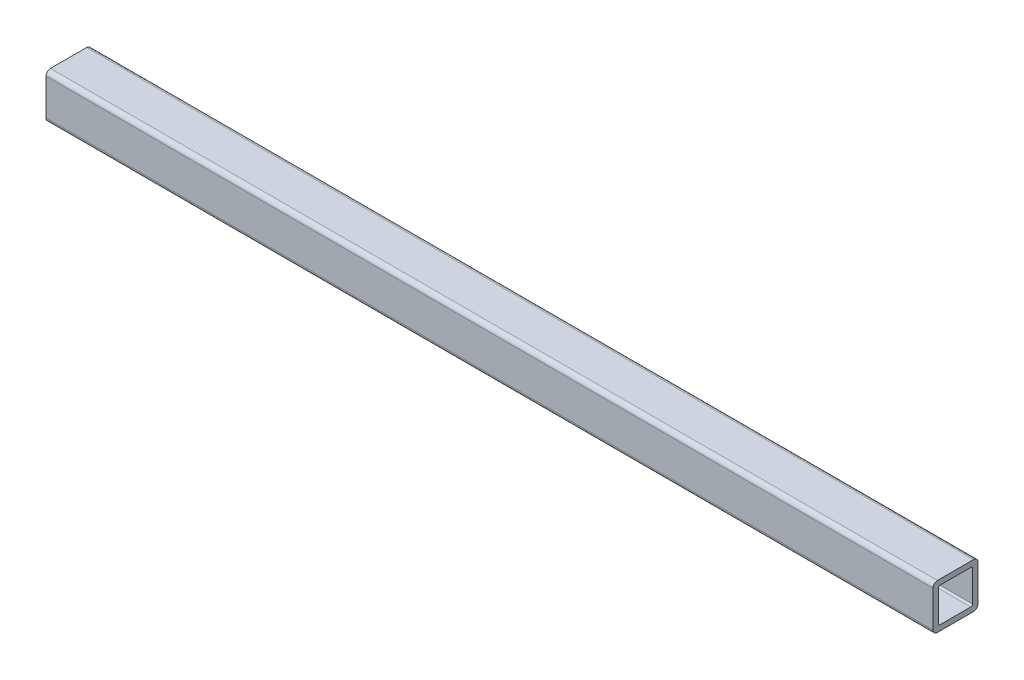
ISO-10303-21;
HEADER;
FILE_DESCRIPTION(('STEP AP214'),'2;1');
FILE_NAME('part.step','',(''),(''),'','','');
FILE_SCHEMA(('AUTOMOTIVE_DESIGN { 1 0 10303 214 1 1 1 1 }'));
ENDSEC;
DATA;
#1=APPLICATION_CONTEXT('core data for automotive mechanical design processes');
#2=APPLICATION_PROTOCOL_DEFINITION('international standard','automotive_design',2000,#1);
#3=PRODUCT_CONTEXT('',#1,'mechanical');
#4=PRODUCT('Part','Part','',(#3));
#5=PRODUCT_RELATED_PRODUCT_CATEGORY('part','',(#4));
#6=PRODUCT_DEFINITION_FORMATION('','',#4);
#7=PRODUCT_DEFINITION_CONTEXT('part definition',#1,'design');
#8=PRODUCT_DEFINITION('design','',#6,#7);
#9=PRODUCT_DEFINITION_SHAPE('','',#8);
#10=(LENGTH_UNIT() NAMED_UNIT(*) SI_UNIT(.MILLI.,.METRE.));
#11=(NAMED_UNIT(*) PLANE_ANGLE_UNIT() SI_UNIT($,.RADIAN.));
#12=(NAMED_UNIT(*) SI_UNIT($,.STERADIAN.) SOLID_ANGLE_UNIT());
#13=UNCERTAINTY_MEASURE_WITH_UNIT(LENGTH_MEASURE(1.E-05),#10,'distance_accuracy_value','');
#14=(GEOMETRIC_REPRESENTATION_CONTEXT(3) GLOBAL_UNCERTAINTY_ASSIGNED_CONTEXT((#13)) GLOBAL_UNIT_ASSIGNED_CONTEXT((#10,
#11,#12)) REPRESENTATION_CONTEXT('',''));
#15=CARTESIAN_POINT('',(0.,0.,0.));
#16=DIRECTION('',(0.,0.,1.));
#17=DIRECTION('',(1.,0.,0.));
#18=AXIS2_PLACEMENT_3D('',#15,#16,#17);
#19=CARTESIAN_POINT('',(-500.,12.7,-12.7));
#20=DIRECTION('',(0.,0.,-1.));
#21=DIRECTION('',(0.,1.,0.));
#22=AXIS2_PLACEMENT_3D('',#19,#20,#21);
#23=PLANE('',#22);
#24=DIRECTION('',(0.,1.,0.));
#25=VECTOR('',#24,1.);
#26=CARTESIAN_POINT('',(0.,12.7,-12.7));
#27=LINE('',#26,#25);
#28=CARTESIAN_POINT('',(0.,-10.2,-12.7));
#29=VERTEX_POINT('',#28);
#30=CARTESIAN_POINT('',(0.,10.2,-12.7));
#31=VERTEX_POINT('',#30);
#32=EDGE_CURVE('E258',#29,#31,#27,.T.);
#33=ORIENTED_EDGE('',*,*,#32,.F.);
#34=DIRECTION('',(1.,0.,0.));
#35=VECTOR('',#34,1.);
#36=CARTESIAN_POINT('',(-500.,-10.2,-12.7));
#37=LINE('',#36,#35);
#38=CARTESIAN_POINT('',(-500.,-10.2,-12.7));
#39=VERTEX_POINT('',#38);
#40=EDGE_CURVE('E187',#29,#39,#37,.F.);
#41=ORIENTED_EDGE('',*,*,#40,.T.);
#42=DIRECTION('',(0.,1.,0.));
#43=VECTOR('',#42,1.);
#44=CARTESIAN_POINT('',(-500.,12.7,-12.7));
#45=LINE('',#44,#43);
#46=CARTESIAN_POINT('',(-500.,10.2,-12.7));
#47=VERTEX_POINT('',#46);
#48=EDGE_CURVE('E168',#39,#47,#45,.T.);
#49=ORIENTED_EDGE('',*,*,#48,.T.);
#50=DIRECTION('',(1.,0.,0.));
#51=VECTOR('',#50,1.);
#52=CARTESIAN_POINT('',(-500.,10.2,-12.7));
#53=LINE('',#52,#51);
#54=EDGE_CURVE('E184',#47,#31,#53,.T.);
#55=ORIENTED_EDGE('',*,*,#54,.T.);
#56=EDGE_LOOP('',(#33,#41,#49,#55));
#57=FACE_BOUND('',#56,.T.);
#58=ADVANCED_FACE('F33',(#57),#23,.T.);
#59=CARTESIAN_POINT('',(-500.,-12.7,12.7));
#60=DIRECTION('',(0.,-1.,0.));
#61=DIRECTION('',(0.,0.,-1.));
#62=AXIS2_PLACEMENT_3D('',#59,#60,#61);
#63=PLANE('',#62);
#64=DIRECTION('',(0.,0.,-1.));
#65=VECTOR('',#64,1.);
#66=CARTESIAN_POINT('',(-500.,-12.7,12.7));
#67=LINE('',#66,#65);
#68=CARTESIAN_POINT('',(-500.,-12.7,10.2));
#69=VERTEX_POINT('',#68);
#70=CARTESIAN_POINT('',(-500.,-12.7,-10.2));
#71=VERTEX_POINT('',#70);
#72=EDGE_CURVE('E173',#69,#71,#67,.T.);
#73=ORIENTED_EDGE('',*,*,#72,.T.);
#74=DIRECTION('',(1.,0.,0.));
#75=VECTOR('',#74,1.);
#76=CARTESIAN_POINT('',(-500.,-12.7,-10.2));
#77=LINE('',#76,#75);
#78=CARTESIAN_POINT('',(0.,-12.7,-10.2));
#79=VERTEX_POINT('',#78);
#80=EDGE_CURVE('E167',#71,#79,#77,.T.);
#81=ORIENTED_EDGE('',*,*,#80,.T.);
#82=DIRECTION('',(0.,0.,-1.));
#83=VECTOR('',#82,1.);
#84=CARTESIAN_POINT('',(0.,-12.7,12.7));
#85=LINE('',#84,#83);
#86=CARTESIAN_POINT('',(0.,-12.7,10.2));
#87=VERTEX_POINT('',#86);
#88=EDGE_CURVE('E150',#87,#79,#85,.T.);
#89=ORIENTED_EDGE('',*,*,#88,.F.);
#90=DIRECTION('',(1.,0.,0.));
#91=VECTOR('',#90,1.);
#92=CARTESIAN_POINT('',(-500.,-12.7,10.2));
#93=LINE('',#92,#91);
#94=EDGE_CURVE('E164',#87,#69,#93,.F.);
#95=ORIENTED_EDGE('',*,*,#94,.T.);
#96=EDGE_LOOP('',(#73,#81,#89,#95));
#97=FACE_BOUND('',#96,.T.);
#98=ADVANCED_FACE('F163',(#97),#63,.T.);
#99=CARTESIAN_POINT('',(-500.,12.7,12.7));
#100=DIRECTION('',(0.,0.,1.));
#101=DIRECTION('',(0.,-1.,0.));
#102=AXIS2_PLACEMENT_3D('',#99,#100,#101);
#103=PLANE('',#102);
#104=DIRECTION('',(0.,-1.,0.));
#105=VECTOR('',#104,1.);
#106=CARTESIAN_POINT('',(-500.,12.7,12.7));
#107=LINE('',#106,#105);
#108=CARTESIAN_POINT('',(-500.,10.2,12.7));
#109=VERTEX_POINT('',#108);
#110=CARTESIAN_POINT('',(-500.,-10.2,12.7));
#111=VERTEX_POINT('',#110);
#112=EDGE_CURVE('E177',#109,#111,#107,.T.);
#113=ORIENTED_EDGE('',*,*,#112,.T.);
#114=DIRECTION('',(1.,0.,0.));
#115=VECTOR('',#114,1.);
#116=CARTESIAN_POINT('',(-500.,-10.2,12.7));
#117=LINE('',#116,#115);
#118=CARTESIAN_POINT('',(0.,-10.2,12.7));
#119=VERTEX_POINT('',#118);
#120=EDGE_CURVE('E198',#111,#119,#117,.T.);
#121=ORIENTED_EDGE('',*,*,#120,.T.);
#122=DIRECTION('',(0.,-1.,0.));
#123=VECTOR('',#122,1.);
#124=CARTESIAN_POINT('',(0.,12.7,12.7));
#125=LINE('',#124,#123);
#126=CARTESIAN_POINT('',(0.,10.2,12.7));
#127=VERTEX_POINT('',#126);
#128=EDGE_CURVE('E152',#127,#119,#125,.T.);
#129=ORIENTED_EDGE('',*,*,#128,.F.);
#130=DIRECTION('',(1.,0.,0.));
#131=VECTOR('',#130,1.);
#132=CARTESIAN_POINT('',(-500.,10.2,12.7));
#133=LINE('',#132,#131);
#134=EDGE_CURVE('E196',#127,#109,#133,.F.);
#135=ORIENTED_EDGE('',*,*,#134,.T.);
#136=EDGE_LOOP('',(#113,#121,#129,#135));
#137=FACE_BOUND('',#136,.T.);
#138=ADVANCED_FACE('F302',(#137),#103,.T.);
#139=CARTESIAN_POINT('',(-500.,12.7,12.7));
#140=DIRECTION('',(0.,1.,0.));
#141=DIRECTION('',(0.,0.,1.));
#142=AXIS2_PLACEMENT_3D('',#139,#140,#141);
#143=PLANE('',#142);
#144=DIRECTION('',(0.,0.,1.));
#145=VECTOR('',#144,1.);
#146=CARTESIAN_POINT('',(0.,12.7,12.7));
#147=LINE('',#146,#145);
#148=CARTESIAN_POINT('',(0.,12.7,-10.2));
#149=VERTEX_POINT('',#148);
#150=CARTESIAN_POINT('',(0.,12.7,10.2));
#151=VERTEX_POINT('',#150);
#152=EDGE_CURVE('E261',#149,#151,#147,.T.);
#153=ORIENTED_EDGE('',*,*,#152,.F.);
#154=DIRECTION('',(1.,0.,0.));
#155=VECTOR('',#154,1.);
#156=CARTESIAN_POINT('',(-500.,12.7,-10.2));
#157=LINE('',#156,#155);
#158=CARTESIAN_POINT('',(-500.,12.7,-10.2));
#159=VERTEX_POINT('',#158);
#160=EDGE_CURVE('E203',#149,#159,#157,.F.);
#161=ORIENTED_EDGE('',*,*,#160,.T.);
#162=DIRECTION('',(0.,0.,1.));
#163=VECTOR('',#162,1.);
#164=CARTESIAN_POINT('',(-500.,12.7,12.7));
#165=LINE('',#164,#163);
#166=CARTESIAN_POINT('',(-500.,12.7,10.2));
#167=VERTEX_POINT('',#166);
#168=EDGE_CURVE('E276',#159,#167,#165,.T.);
#169=ORIENTED_EDGE('',*,*,#168,.T.);
#170=DIRECTION('',(1.,0.,0.));
#171=VECTOR('',#170,1.);
#172=CARTESIAN_POINT('',(-500.,12.7,10.2));
#173=LINE('',#172,#171);
#174=EDGE_CURVE('E200',#167,#151,#173,.T.);
#175=ORIENTED_EDGE('',*,*,#174,.T.);
#176=EDGE_LOOP('',(#153,#161,#169,#175));
#177=FACE_BOUND('',#176,.T.);
#178=ADVANCED_FACE('F285',(#177),#143,.T.);
#179=CARTESIAN_POINT('',(-500.,0.,0.));
#180=DIRECTION('',(1.,0.,0.));
#181=DIRECTION('',(0.,0.,-1.));
#182=AXIS2_PLACEMENT_3D('',#179,#180,#181);
#183=PLANE('',#182);
#184=DIRECTION('',(0.,-1.,0.));
#185=VECTOR('',#184,1.);
#186=CARTESIAN_POINT('',(-500.,-9.652,9.652));
#187=LINE('',#186,#185);
#188=CARTESIAN_POINT('',(-500.,8.652,9.652));
#189=VERTEX_POINT('',#188);
#190=CARTESIAN_POINT('',(-500.,-8.652,9.652));
#191=VERTEX_POINT('',#190);
#192=EDGE_CURVE('E254',#189,#191,#187,.T.);
#193=ORIENTED_EDGE('',*,*,#192,.T.);
#194=CARTESIAN_POINT('',(-500.,-8.652,8.652));
#195=DIRECTION('',(1.,0.,0.));
#196=DIRECTION('',(0.,0.,-1.));
#197=AXIS2_PLACEMENT_3D('',#194,#195,#196);
#198=CIRCLE('',#197,1.);
#199=CARTESIAN_POINT('',(-500.,-9.652,8.652));
#200=VERTEX_POINT('',#199);
#201=EDGE_CURVE('E11',#191,#200,#198,.T.);
#202=ORIENTED_EDGE('',*,*,#201,.T.);
#203=DIRECTION('',(0.,0.,-1.));
#204=VECTOR('',#203,1.);
#205=CARTESIAN_POINT('',(-500.,-9.652,9.652));
#206=LINE('',#205,#204);
#207=CARTESIAN_POINT('',(-500.,-9.652,-8.652));
#208=VERTEX_POINT('',#207);
#209=EDGE_CURVE('E252',#200,#208,#206,.T.);
#210=ORIENTED_EDGE('',*,*,#209,.T.);
#211=CARTESIAN_POINT('',(-500.,-8.652,-8.652));
#212=DIRECTION('',(1.,0.,0.));
#213=DIRECTION('',(0.,0.,-1.));
#214=AXIS2_PLACEMENT_3D('',#211,#212,#213);
#215=CIRCLE('',#214,1.);
#216=CARTESIAN_POINT('',(-500.,-8.652,-9.652));
#217=VERTEX_POINT('',#216);
#218=EDGE_CURVE('E226',#208,#217,#215,.T.);
#219=ORIENTED_EDGE('',*,*,#218,.T.);
#220=DIRECTION('',(0.,1.,0.));
#221=VECTOR('',#220,1.);
#222=CARTESIAN_POINT('',(-500.,-9.652,-9.652));
#223=LINE('',#222,#221);
#224=CARTESIAN_POINT('',(-500.,8.652,-9.652));
#225=VERTEX_POINT('',#224);
#226=EDGE_CURVE('E273',#217,#225,#223,.T.);
#227=ORIENTED_EDGE('',*,*,#226,.T.);
#228=CARTESIAN_POINT('',(-500.,8.652,-8.652));
#229=DIRECTION('',(1.,0.,0.));
#230=DIRECTION('',(0.,0.,-1.));
#231=AXIS2_PLACEMENT_3D('',#228,#229,#230);
#232=CIRCLE('',#231,1.);
#233=CARTESIAN_POINT('',(-500.,9.652,-8.652));
#234=VERTEX_POINT('',#233);
#235=EDGE_CURVE('E230',#225,#234,#232,.T.);
#236=ORIENTED_EDGE('',*,*,#235,.T.);
#237=DIRECTION('',(0.,0.,1.));
#238=VECTOR('',#237,1.);
#239=CARTESIAN_POINT('',(-500.,9.652,9.652));
#240=LINE('',#239,#238);
#241=CARTESIAN_POINT('',(-500.,9.652,8.652));
#242=VERTEX_POINT('',#241);
#243=EDGE_CURVE('E263',#234,#242,#240,.T.);
#244=ORIENTED_EDGE('',*,*,#243,.T.);
#245=CARTESIAN_POINT('',(-500.,8.652,8.652));
#246=DIRECTION('',(1.,0.,0.));
#247=DIRECTION('',(0.,0.,-1.));
#248=AXIS2_PLACEMENT_3D('',#245,#246,#247);
#249=CIRCLE('',#248,1.);
#250=EDGE_CURVE('E55',#242,#189,#249,.T.);
#251=ORIENTED_EDGE('',*,*,#250,.T.);
#252=EDGE_LOOP('',(#193,#202,#210,#219,#227,#236,#244,#251));
#253=FACE_BOUND('',#252,.T.);
#254=ORIENTED_EDGE('',*,*,#48,.F.);
#255=CARTESIAN_POINT('',(-500.,-10.2,-10.2));
#256=DIRECTION('',(1.,0.,0.));
#257=DIRECTION('',(0.,0.,-1.));
#258=AXIS2_PLACEMENT_3D('',#255,#256,#257);
#259=CIRCLE('',#258,2.5);
#260=EDGE_CURVE('E194',#39,#71,#259,.F.);
#261=ORIENTED_EDGE('',*,*,#260,.T.);
#262=ORIENTED_EDGE('',*,*,#72,.F.);
#263=CARTESIAN_POINT('',(-500.,-10.2,10.2));
#264=DIRECTION('',(1.,0.,0.));
#265=DIRECTION('',(0.,0.,-1.));
#266=AXIS2_PLACEMENT_3D('',#263,#264,#265);
#267=CIRCLE('',#266,2.5);
#268=EDGE_CURVE('E172',#69,#111,#267,.F.);
#269=ORIENTED_EDGE('',*,*,#268,.T.);
#270=ORIENTED_EDGE('',*,*,#112,.F.);
#271=CARTESIAN_POINT('',(-500.,10.2,10.2));
#272=DIRECTION('',(1.,0.,0.));
#273=DIRECTION('',(0.,0.,-1.));
#274=AXIS2_PLACEMENT_3D('',#271,#272,#273);
#275=CIRCLE('',#274,2.5);
#276=EDGE_CURVE('E189',#109,#167,#275,.F.);
#277=ORIENTED_EDGE('',*,*,#276,.T.);
#278=ORIENTED_EDGE('',*,*,#168,.F.);
#279=CARTESIAN_POINT('',(-500.,10.2,-10.2));
#280=DIRECTION('',(1.,0.,0.));
#281=DIRECTION('',(0.,0.,-1.));
#282=AXIS2_PLACEMENT_3D('',#279,#280,#281);
#283=CIRCLE('',#282,2.5);
#284=EDGE_CURVE('E191',#159,#47,#283,.F.);
#285=ORIENTED_EDGE('',*,*,#284,.T.);
#286=EDGE_LOOP('',(#254,#261,#262,#269,#270,#277,#278,#285));
#287=FACE_BOUND('',#286,.T.);
#288=ADVANCED_FACE('F250',(#253,#287),#183,.F.);
#289=CARTESIAN_POINT('',(0.,0.,0.));
#290=DIRECTION('',(1.,0.,0.));
#291=DIRECTION('',(0.,0.,-1.));
#292=AXIS2_PLACEMENT_3D('',#289,#290,#291);
#293=PLANE('',#292);
#294=DIRECTION('',(0.,1.,0.));
#295=VECTOR('',#294,1.);
#296=CARTESIAN_POINT('',(0.,-9.652,-9.652));
#297=LINE('',#296,#295);
#298=CARTESIAN_POINT('',(0.,-8.652,-9.652));
#299=VERTEX_POINT('',#298);
#300=CARTESIAN_POINT('',(0.,8.652,-9.652));
#301=VERTEX_POINT('',#300);
#302=EDGE_CURVE('E267',#299,#301,#297,.T.);
#303=ORIENTED_EDGE('',*,*,#302,.F.);
#304=CARTESIAN_POINT('',(0.,-8.652,-8.652));
#305=DIRECTION('',(1.,0.,0.));
#306=DIRECTION('',(0.,0.,-1.));
#307=AXIS2_PLACEMENT_3D('',#304,#305,#306);
#308=CIRCLE('',#307,1.);
#309=CARTESIAN_POINT('',(0.,-9.652,-8.652));
#310=VERTEX_POINT('',#309);
#311=EDGE_CURVE('E224',#299,#310,#308,.F.);
#312=ORIENTED_EDGE('',*,*,#311,.T.);
#313=DIRECTION('',(0.,0.,-1.));
#314=VECTOR('',#313,1.);
#315=CARTESIAN_POINT('',(0.,-9.652,9.652));
#316=LINE('',#315,#314);
#317=CARTESIAN_POINT('',(0.,-9.652,8.652));
#318=VERTEX_POINT('',#317);
#319=EDGE_CURVE('E240',#318,#310,#316,.T.);
#320=ORIENTED_EDGE('',*,*,#319,.F.);
#321=CARTESIAN_POINT('',(0.,-8.652,8.652));
#322=DIRECTION('',(1.,0.,0.));
#323=DIRECTION('',(0.,0.,-1.));
#324=AXIS2_PLACEMENT_3D('',#321,#322,#323);
#325=CIRCLE('',#324,1.);
#326=CARTESIAN_POINT('',(0.,-8.652,9.652));
#327=VERTEX_POINT('',#326);
#328=EDGE_CURVE('E41',#318,#327,#325,.F.);
#329=ORIENTED_EDGE('',*,*,#328,.T.);
#330=DIRECTION('',(0.,-1.,0.));
#331=VECTOR('',#330,1.);
#332=CARTESIAN_POINT('',(0.,-9.652,9.652));
#333=LINE('',#332,#331);
#334=CARTESIAN_POINT('',(0.,8.652,9.652));
#335=VERTEX_POINT('',#334);
#336=EDGE_CURVE('E238',#335,#327,#333,.T.);
#337=ORIENTED_EDGE('',*,*,#336,.F.);
#338=CARTESIAN_POINT('',(0.,8.652,8.652));
#339=DIRECTION('',(1.,0.,0.));
#340=DIRECTION('',(0.,0.,-1.));
#341=AXIS2_PLACEMENT_3D('',#338,#339,#340);
#342=CIRCLE('',#341,1.);
#343=CARTESIAN_POINT('',(0.,9.652,8.652));
#344=VERTEX_POINT('',#343);
#345=EDGE_CURVE('E232',#335,#344,#342,.F.);
#346=ORIENTED_EDGE('',*,*,#345,.T.);
#347=DIRECTION('',(0.,0.,1.));
#348=VECTOR('',#347,1.);
#349=CARTESIAN_POINT('',(0.,9.652,9.652));
#350=LINE('',#349,#348);
#351=CARTESIAN_POINT('',(0.,9.652,-8.652));
#352=VERTEX_POINT('',#351);
#353=EDGE_CURVE('E245',#352,#344,#350,.T.);
#354=ORIENTED_EDGE('',*,*,#353,.F.);
#355=CARTESIAN_POINT('',(0.,8.652,-8.652));
#356=DIRECTION('',(1.,0.,0.));
#357=DIRECTION('',(0.,0.,-1.));
#358=AXIS2_PLACEMENT_3D('',#355,#356,#357);
#359=CIRCLE('',#358,1.);
#360=EDGE_CURVE('E228',#352,#301,#359,.F.);
#361=ORIENTED_EDGE('',*,*,#360,.T.);
#362=EDGE_LOOP('',(#303,#312,#320,#329,#337,#346,#354,#361));
#363=FACE_BOUND('',#362,.T.);
#364=ORIENTED_EDGE('',*,*,#88,.T.);
#365=CARTESIAN_POINT('',(0.,-10.2,-10.2));
#366=DIRECTION('',(1.,0.,0.));
#367=DIRECTION('',(0.,0.,-1.));
#368=AXIS2_PLACEMENT_3D('',#365,#366,#367);
#369=CIRCLE('',#368,2.5);
#370=EDGE_CURVE('E157',#79,#29,#369,.T.);
#371=ORIENTED_EDGE('',*,*,#370,.T.);
#372=ORIENTED_EDGE('',*,*,#32,.T.);
#373=CARTESIAN_POINT('',(0.,10.2,-10.2));
#374=DIRECTION('',(1.,0.,0.));
#375=DIRECTION('',(0.,0.,-1.));
#376=AXIS2_PLACEMENT_3D('',#373,#374,#375);
#377=CIRCLE('',#376,2.5);
#378=EDGE_CURVE('E158',#31,#149,#377,.T.);
#379=ORIENTED_EDGE('',*,*,#378,.T.);
#380=ORIENTED_EDGE('',*,*,#152,.T.);
#381=CARTESIAN_POINT('',(0.,10.2,10.2));
#382=DIRECTION('',(1.,0.,0.));
#383=DIRECTION('',(0.,0.,-1.));
#384=AXIS2_PLACEMENT_3D('',#381,#382,#383);
#385=CIRCLE('',#384,2.5);
#386=EDGE_CURVE('E175',#151,#127,#385,.T.);
#387=ORIENTED_EDGE('',*,*,#386,.T.);
#388=ORIENTED_EDGE('',*,*,#128,.T.);
#389=CARTESIAN_POINT('',(0.,-10.2,10.2));
#390=DIRECTION('',(1.,0.,0.));
#391=DIRECTION('',(0.,0.,-1.));
#392=AXIS2_PLACEMENT_3D('',#389,#390,#391);
#393=CIRCLE('',#392,2.5);
#394=EDGE_CURVE('E147',#119,#87,#393,.T.);
#395=ORIENTED_EDGE('',*,*,#394,.T.);
#396=EDGE_LOOP('',(#364,#371,#372,#379,#380,#387,#388,#395));
#397=FACE_BOUND('',#396,.T.);
#398=ADVANCED_FACE('F149',(#363,#397),#293,.T.);
#399=CARTESIAN_POINT('',(-500.,-9.652,-9.652));
#400=DIRECTION('',(0.,0.,-1.));
#401=DIRECTION('',(-1.,0.,0.));
#402=AXIS2_PLACEMENT_3D('',#399,#400,#401);
#403=PLANE('',#402);
#404=ORIENTED_EDGE('',*,*,#226,.F.);
#405=DIRECTION('',(1.,0.,0.));
#406=VECTOR('',#405,1.);
#407=CARTESIAN_POINT('',(0.,-8.652,-9.652));
#408=LINE('',#407,#406);
#409=EDGE_CURVE('E207',#217,#299,#408,.T.);
#410=ORIENTED_EDGE('',*,*,#409,.T.);
#411=ORIENTED_EDGE('',*,*,#302,.T.);
#412=DIRECTION('',(1.,0.,0.));
#413=VECTOR('',#412,1.);
#414=CARTESIAN_POINT('',(-500.,8.652,-9.652));
#415=LINE('',#414,#413);
#416=EDGE_CURVE('E205',#301,#225,#415,.F.);
#417=ORIENTED_EDGE('',*,*,#416,.T.);
#418=EDGE_LOOP('',(#404,#410,#411,#417));
#419=FACE_BOUND('',#418,.T.);
#420=ADVANCED_FACE('F363',(#419),#403,.F.);
#421=CARTESIAN_POINT('',(-500.,-9.652,9.652));
#422=DIRECTION('',(0.,-1.,0.));
#423=DIRECTION('',(0.,0.,-1.));
#424=AXIS2_PLACEMENT_3D('',#421,#422,#423);
#425=PLANE('',#424);
#426=ORIENTED_EDGE('',*,*,#319,.T.);
#427=DIRECTION('',(1.,0.,0.));
#428=VECTOR('',#427,1.);
#429=CARTESIAN_POINT('',(-500.,-9.652,-8.652));
#430=LINE('',#429,#428);
#431=EDGE_CURVE('E213',#310,#208,#430,.F.);
#432=ORIENTED_EDGE('',*,*,#431,.T.);
#433=ORIENTED_EDGE('',*,*,#209,.F.);
#434=DIRECTION('',(1.,0.,0.));
#435=VECTOR('',#434,1.);
#436=CARTESIAN_POINT('',(0.,-9.652,8.652));
#437=LINE('',#436,#435);
#438=EDGE_CURVE('E210',#200,#318,#437,.T.);
#439=ORIENTED_EDGE('',*,*,#438,.T.);
#440=EDGE_LOOP('',(#426,#432,#433,#439));
#441=FACE_BOUND('',#440,.T.);
#442=ADVANCED_FACE('F256',(#441),#425,.F.);
#443=CARTESIAN_POINT('',(-500.,-9.652,9.652));
#444=DIRECTION('',(0.,0.,1.));
#445=DIRECTION('',(1.,0.,0.));
#446=AXIS2_PLACEMENT_3D('',#443,#444,#445);
#447=PLANE('',#446);
#448=ORIENTED_EDGE('',*,*,#192,.F.);
#449=DIRECTION('',(1.,0.,0.));
#450=VECTOR('',#449,1.);
#451=CARTESIAN_POINT('',(0.,8.652,9.652));
#452=LINE('',#451,#450);
#453=EDGE_CURVE('E221',#189,#335,#452,.T.);
#454=ORIENTED_EDGE('',*,*,#453,.T.);
#455=ORIENTED_EDGE('',*,*,#336,.T.);
#456=DIRECTION('',(1.,0.,0.));
#457=VECTOR('',#456,1.);
#458=CARTESIAN_POINT('',(-500.,-8.652,9.652));
#459=LINE('',#458,#457);
#460=EDGE_CURVE('E48',#327,#191,#459,.F.);
#461=ORIENTED_EDGE('',*,*,#460,.T.);
#462=EDGE_LOOP('',(#448,#454,#455,#461));
#463=FACE_BOUND('',#462,.T.);
#464=ADVANCED_FACE('F243',(#463),#447,.F.);
#465=CARTESIAN_POINT('',(-500.,9.652,9.652));
#466=DIRECTION('',(0.,1.,0.));
#467=DIRECTION('',(0.,0.,1.));
#468=AXIS2_PLACEMENT_3D('',#465,#466,#467);
#469=PLANE('',#468);
#470=ORIENTED_EDGE('',*,*,#243,.F.);
#471=DIRECTION('',(1.,0.,0.));
#472=VECTOR('',#471,1.);
#473=CARTESIAN_POINT('',(0.,9.652,-8.652));
#474=LINE('',#473,#472);
#475=EDGE_CURVE('E217',#234,#352,#474,.T.);
#476=ORIENTED_EDGE('',*,*,#475,.T.);
#477=ORIENTED_EDGE('',*,*,#353,.T.);
#478=DIRECTION('',(1.,0.,0.));
#479=VECTOR('',#478,1.);
#480=CARTESIAN_POINT('',(-500.,9.652,8.652));
#481=LINE('',#480,#479);
#482=EDGE_CURVE('E215',#344,#242,#481,.F.);
#483=ORIENTED_EDGE('',*,*,#482,.T.);
#484=EDGE_LOOP('',(#470,#476,#477,#483));
#485=FACE_BOUND('',#484,.T.);
#486=ADVANCED_FACE('F328',(#485),#469,.F.);
#487=CARTESIAN_POINT('',(-500.,-10.2,-10.2));
#488=DIRECTION('',(1.,0.,0.));
#489=DIRECTION('',(0.,0.,-1.));
#490=AXIS2_PLACEMENT_3D('',#487,#488,#489);
#491=CYLINDRICAL_SURFACE('',#490,2.5);
#492=ORIENTED_EDGE('',*,*,#260,.F.);
#493=ORIENTED_EDGE('',*,*,#40,.F.);
#494=ORIENTED_EDGE('',*,*,#370,.F.);
#495=ORIENTED_EDGE('',*,*,#80,.F.);
#496=EDGE_LOOP('',(#492,#493,#494,#495));
#497=FACE_BOUND('',#496,.T.);
#498=ADVANCED_FACE('F298',(#497),#491,.T.);
#499=CARTESIAN_POINT('',(-500.,-10.2,10.2));
#500=DIRECTION('',(1.,0.,0.));
#501=DIRECTION('',(0.,0.,-1.));
#502=AXIS2_PLACEMENT_3D('',#499,#500,#501);
#503=CYLINDRICAL_SURFACE('',#502,2.5);
#504=ORIENTED_EDGE('',*,*,#268,.F.);
#505=ORIENTED_EDGE('',*,*,#94,.F.);
#506=ORIENTED_EDGE('',*,*,#394,.F.);
#507=ORIENTED_EDGE('',*,*,#120,.F.);
#508=EDGE_LOOP('',(#504,#505,#506,#507));
#509=FACE_BOUND('',#508,.T.);
#510=ADVANCED_FACE('F171',(#509),#503,.T.);
#511=CARTESIAN_POINT('',(-500.,10.2,-10.2));
#512=DIRECTION('',(1.,0.,0.));
#513=DIRECTION('',(0.,0.,-1.));
#514=AXIS2_PLACEMENT_3D('',#511,#512,#513);
#515=CYLINDRICAL_SURFACE('',#514,2.5);
#516=ORIENTED_EDGE('',*,*,#284,.F.);
#517=ORIENTED_EDGE('',*,*,#160,.F.);
#518=ORIENTED_EDGE('',*,*,#378,.F.);
#519=ORIENTED_EDGE('',*,*,#54,.F.);
#520=EDGE_LOOP('',(#516,#517,#518,#519));
#521=FACE_BOUND('',#520,.T.);
#522=ADVANCED_FACE('F290',(#521),#515,.T.);
#523=CARTESIAN_POINT('',(-500.,10.2,10.2));
#524=DIRECTION('',(1.,0.,0.));
#525=DIRECTION('',(0.,0.,-1.));
#526=AXIS2_PLACEMENT_3D('',#523,#524,#525);
#527=CYLINDRICAL_SURFACE('',#526,2.5);
#528=ORIENTED_EDGE('',*,*,#276,.F.);
#529=ORIENTED_EDGE('',*,*,#134,.F.);
#530=ORIENTED_EDGE('',*,*,#386,.F.);
#531=ORIENTED_EDGE('',*,*,#174,.F.);
#532=EDGE_LOOP('',(#528,#529,#530,#531));
#533=FACE_BOUND('',#532,.T.);
#534=ADVANCED_FACE('F305',(#533),#527,.T.);
#535=CARTESIAN_POINT('',(-500.,-8.652,-8.652));
#536=DIRECTION('',(-1.,0.,0.));
#537=DIRECTION('',(0.,0.,1.));
#538=AXIS2_PLACEMENT_3D('',#535,#536,#537);
#539=CYLINDRICAL_SURFACE('',#538,1.);
#540=ORIENTED_EDGE('',*,*,#218,.F.);
#541=ORIENTED_EDGE('',*,*,#431,.F.);
#542=ORIENTED_EDGE('',*,*,#311,.F.);
#543=ORIENTED_EDGE('',*,*,#409,.F.);
#544=EDGE_LOOP('',(#540,#541,#542,#543));
#545=FACE_BOUND('',#544,.T.);
#546=ADVANCED_FACE('F307',(#545),#539,.F.);
#547=CARTESIAN_POINT('',(-500.,8.652,-8.652));
#548=DIRECTION('',(-1.,0.,0.));
#549=DIRECTION('',(0.,0.,1.));
#550=AXIS2_PLACEMENT_3D('',#547,#548,#549);
#551=CYLINDRICAL_SURFACE('',#550,1.);
#552=ORIENTED_EDGE('',*,*,#235,.F.);
#553=ORIENTED_EDGE('',*,*,#416,.F.);
#554=ORIENTED_EDGE('',*,*,#360,.F.);
#555=ORIENTED_EDGE('',*,*,#475,.F.);
#556=EDGE_LOOP('',(#552,#553,#554,#555));
#557=FACE_BOUND('',#556,.T.);
#558=ADVANCED_FACE('F313',(#557),#551,.F.);
#559=CARTESIAN_POINT('',(-500.,8.652,8.652));
#560=DIRECTION('',(-1.,0.,0.));
#561=DIRECTION('',(0.,0.,1.));
#562=AXIS2_PLACEMENT_3D('',#559,#560,#561);
#563=CYLINDRICAL_SURFACE('',#562,1.);
#564=ORIENTED_EDGE('',*,*,#250,.F.);
#565=ORIENTED_EDGE('',*,*,#482,.F.);
#566=ORIENTED_EDGE('',*,*,#345,.F.);
#567=ORIENTED_EDGE('',*,*,#453,.F.);
#568=EDGE_LOOP('',(#564,#565,#566,#567));
#569=FACE_BOUND('',#568,.T.);
#570=ADVANCED_FACE('F411',(#569),#563,.F.);
#571=CARTESIAN_POINT('',(-500.,-8.652,8.652));
#572=DIRECTION('',(-1.,0.,0.));
#573=DIRECTION('',(0.,0.,1.));
#574=AXIS2_PLACEMENT_3D('',#571,#572,#573);
#575=CYLINDRICAL_SURFACE('',#574,1.);
#576=ORIENTED_EDGE('',*,*,#201,.F.);
#577=ORIENTED_EDGE('',*,*,#460,.F.);
#578=ORIENTED_EDGE('',*,*,#328,.F.);
#579=ORIENTED_EDGE('',*,*,#438,.F.);
#580=EDGE_LOOP('',(#576,#577,#578,#579));
#581=FACE_BOUND('',#580,.T.);
#582=ADVANCED_FACE('F35',(#581),#575,.F.);
#583=CLOSED_SHELL('',(#58,#98,#138,#178,#288,#398,#420,#442,#464,#486,#498,#510,#522,#534,#546,
#558,#570,#582));
#584=MANIFOLD_SOLID_BREP('B2',#583);
#585=ADVANCED_BREP_SHAPE_REPRESENTATION('',(#18,#584),#14);
#586=SHAPE_DEFINITION_REPRESENTATION(#9,#585);
ENDSEC;
END-ISO-10303-21;
